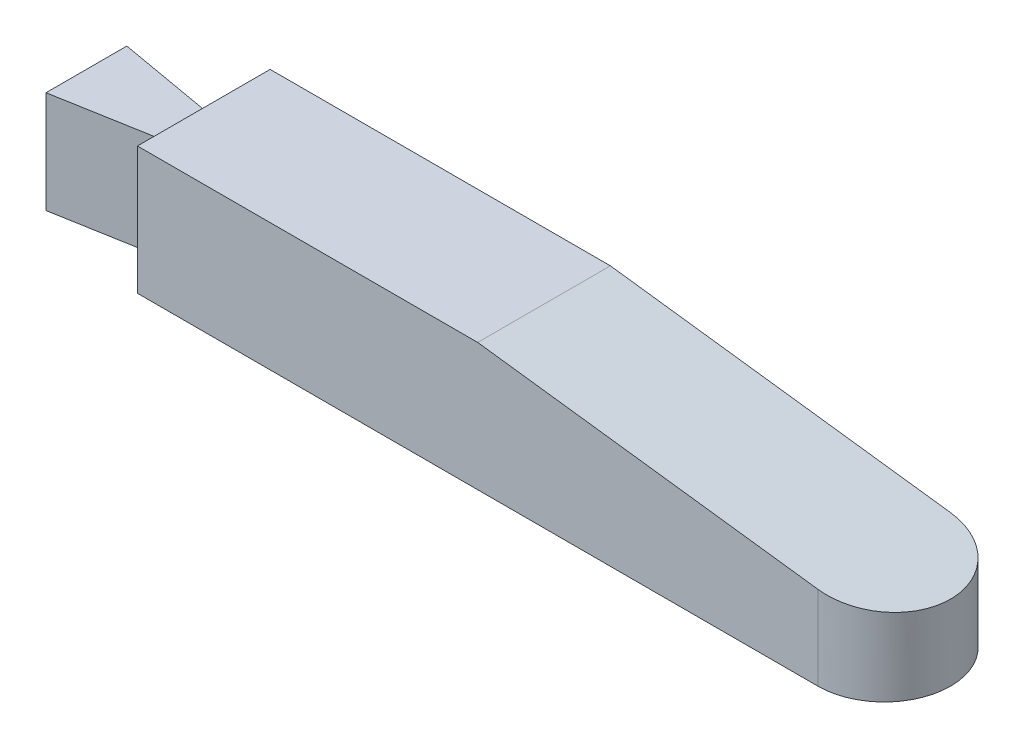
ISO-10303-21;
HEADER;
FILE_DESCRIPTION(('STEP AP214'),'2;1');
FILE_NAME('part.step','',(''),(''),'','','');
FILE_SCHEMA(('AUTOMOTIVE_DESIGN { 1 0 10303 214 1 1 1 1 }'));
ENDSEC;
DATA;
#1=APPLICATION_CONTEXT('core data for automotive mechanical design processes');
#2=APPLICATION_PROTOCOL_DEFINITION('international standard','automotive_design',2000,#1);
#3=PRODUCT_CONTEXT('',#1,'mechanical');
#4=PRODUCT('Part','Part','',(#3));
#5=PRODUCT_RELATED_PRODUCT_CATEGORY('part','',(#4));
#6=PRODUCT_DEFINITION_FORMATION('','',#4);
#7=PRODUCT_DEFINITION_CONTEXT('part definition',#1,'design');
#8=PRODUCT_DEFINITION('design','',#6,#7);
#9=PRODUCT_DEFINITION_SHAPE('','',#8);
#10=(LENGTH_UNIT() NAMED_UNIT(*) SI_UNIT(.MILLI.,.METRE.));
#11=(NAMED_UNIT(*) PLANE_ANGLE_UNIT() SI_UNIT($,.RADIAN.));
#12=(NAMED_UNIT(*) SI_UNIT($,.STERADIAN.) SOLID_ANGLE_UNIT());
#13=UNCERTAINTY_MEASURE_WITH_UNIT(LENGTH_MEASURE(1.E-05),#10,'distance_accuracy_value','');
#14=(GEOMETRIC_REPRESENTATION_CONTEXT(3) GLOBAL_UNCERTAINTY_ASSIGNED_CONTEXT((#13)) GLOBAL_UNIT_ASSIGNED_CONTEXT((#10,
#11,#12)) REPRESENTATION_CONTEXT('',''));
#15=CARTESIAN_POINT('',(0.,0.,0.));
#16=DIRECTION('',(0.,0.,1.));
#17=DIRECTION('',(1.,0.,0.));
#18=AXIS2_PLACEMENT_3D('',#15,#16,#17);
#19=CARTESIAN_POINT('',(-13.5492408882498,38.1,8.6448900000001));
#20=DIRECTION('',(-0.173648177666927,0.,0.984807753012209));
#21=DIRECTION('',(0.984807753012209,0.,0.173648177666927));
#22=AXIS2_PLACEMENT_3D('',#19,#20,#21);
#23=PLANE('',#22);
#24=DIRECTION('',(-0.984807753012209,0.,-0.173648177666927));
#25=VECTOR('',#24,1.);
#26=CARTESIAN_POINT('',(21.5027591117502,30.48,14.8255033277931));
#27=LINE('',#26,#25);
#28=CARTESIAN_POINT('',(21.5027591117502,30.48,14.8255033277931));
#29=VERTEX_POINT('',#28);
#30=CARTESIAN_POINT('',(-13.5492408882498,30.48,8.6448900000001));
#31=VERTEX_POINT('',#30);
#32=EDGE_CURVE('E198',#29,#31,#27,.T.);
#33=ORIENTED_EDGE('',*,*,#32,.F.);
#34=DIRECTION('',(0.,-1.,0.));
#35=VECTOR('',#34,1.);
#36=CARTESIAN_POINT('',(21.5027591117502,38.1,14.8255033277931));
#37=LINE('',#36,#35);
#38=CARTESIAN_POINT('',(21.5027591117502,0.,14.8255033277931));
#39=VERTEX_POINT('',#38);
#40=EDGE_CURVE('E11',#29,#39,#37,.T.);
#41=ORIENTED_EDGE('',*,*,#40,.T.);
#42=DIRECTION('',(-0.984807753012209,0.,-0.173648177666927));
#43=VECTOR('',#42,1.);
#44=CARTESIAN_POINT('',(-13.5492408882498,0.,8.6448900000001));
#45=LINE('',#44,#43);
#46=CARTESIAN_POINT('',(-13.5492408882498,0.,8.6448900000001));
#47=VERTEX_POINT('',#46);
#48=EDGE_CURVE('E124',#39,#47,#45,.T.);
#49=ORIENTED_EDGE('',*,*,#48,.T.);
#50=DIRECTION('',(0.,-1.,0.));
#51=VECTOR('',#50,1.);
#52=CARTESIAN_POINT('',(-13.5492408882498,38.1,8.6448900000001));
#53=LINE('',#52,#51);
#54=EDGE_CURVE('E53',#31,#47,#53,.T.);
#55=ORIENTED_EDGE('',*,*,#54,.F.);
#56=EDGE_LOOP('',(#33,#41,#49,#55));
#57=FACE_BOUND('',#56,.T.);
#58=ADVANCED_FACE('F45',(#57),#23,.F.);
#59=CARTESIAN_POINT('',(-13.5492408882498,38.1,8.6448900000001));
#60=DIRECTION('',(1.,0.,0.));
#61=DIRECTION('',(0.,0.,-1.));
#62=AXIS2_PLACEMENT_3D('',#59,#60,#61);
#63=PLANE('',#62);
#64=DIRECTION('',(0.,0.,1.));
#65=VECTOR('',#64,1.);
#66=CARTESIAN_POINT('',(-13.5492408882498,30.48,8.6448900000001));
#67=LINE('',#66,#65);
#68=CARTESIAN_POINT('',(-13.5492408882498,30.48,32.7748900000001));
#69=VERTEX_POINT('',#68);
#70=EDGE_CURVE('E177',#31,#69,#67,.T.);
#71=ORIENTED_EDGE('',*,*,#70,.F.);
#72=ORIENTED_EDGE('',*,*,#54,.T.);
#73=DIRECTION('',(0.,0.,1.));
#74=VECTOR('',#73,1.);
#75=CARTESIAN_POINT('',(-13.5492408882498,0.,8.6448900000001));
#76=LINE('',#75,#74);
#77=CARTESIAN_POINT('',(-13.5492408882498,0.,32.7748900000001));
#78=VERTEX_POINT('',#77);
#79=EDGE_CURVE('E130',#47,#78,#76,.T.);
#80=ORIENTED_EDGE('',*,*,#79,.T.);
#81=DIRECTION('',(0.,-1.,0.));
#82=VECTOR('',#81,1.);
#83=CARTESIAN_POINT('',(-13.5492408882498,38.1,32.7748900000001));
#84=LINE('',#83,#82);
#85=EDGE_CURVE('E166',#69,#78,#84,.T.);
#86=ORIENTED_EDGE('',*,*,#85,.F.);
#87=EDGE_LOOP('',(#71,#72,#80,#86));
#88=FACE_BOUND('',#87,.T.);
#89=ADVANCED_FACE('F172',(#88),#63,.F.);
#90=CARTESIAN_POINT('',(-13.5492408882498,38.1,32.7748900000001));
#91=DIRECTION('',(-0.173648177666935,0.,-0.984807753012207));
#92=DIRECTION('',(-0.984807753012207,0.,0.173648177666935));
#93=AXIS2_PLACEMENT_3D('',#90,#91,#92);
#94=PLANE('',#93);
#95=DIRECTION('',(0.984807753012207,0.,-0.173648177666935));
#96=VECTOR('',#95,1.);
#97=CARTESIAN_POINT('',(-13.5492408882498,30.48,32.7748900000001));
#98=LINE('',#97,#96);
#99=CARTESIAN_POINT('',(21.5027591117502,30.48,26.5942766722068));
#100=VERTEX_POINT('',#99);
#101=EDGE_CURVE('E133',#69,#100,#98,.T.);
#102=ORIENTED_EDGE('',*,*,#101,.F.);
#103=ORIENTED_EDGE('',*,*,#85,.T.);
#104=DIRECTION('',(0.984807753012207,0.,-0.173648177666935));
#105=VECTOR('',#104,1.);
#106=CARTESIAN_POINT('',(-13.5492408882498,0.,32.7748900000001));
#107=LINE('',#106,#105);
#108=CARTESIAN_POINT('',(21.5027591117502,0.,26.5942766722068));
#109=VERTEX_POINT('',#108);
#110=EDGE_CURVE('E141',#78,#109,#107,.T.);
#111=ORIENTED_EDGE('',*,*,#110,.T.);
#112=DIRECTION('',(0.,-1.,0.));
#113=VECTOR('',#112,1.);
#114=CARTESIAN_POINT('',(21.5027591117502,38.1,26.5942766722068));
#115=LINE('',#114,#113);
#116=EDGE_CURVE('E163',#100,#109,#115,.T.);
#117=ORIENTED_EDGE('',*,*,#116,.F.);
#118=EDGE_LOOP('',(#102,#103,#111,#117));
#119=FACE_BOUND('',#118,.T.);
#120=ADVANCED_FACE('F185',(#119),#94,.F.);
#121=CARTESIAN_POINT('',(21.5027591117502,38.1,40.5218900000002));
#122=DIRECTION('',(1.,0.,0.));
#123=DIRECTION('',(0.,0.,-1.));
#124=AXIS2_PLACEMENT_3D('',#121,#122,#123);
#125=PLANE('',#124);
#126=DIRECTION('',(0.,0.,1.));
#127=VECTOR('',#126,1.);
#128=CARTESIAN_POINT('',(21.5027591117502,0.,40.5218900000002));
#129=LINE('',#128,#127);
#130=CARTESIAN_POINT('',(21.5027591117502,0.,40.5218900000002));
#131=VERTEX_POINT('',#130);
#132=EDGE_CURVE('E145',#109,#131,#129,.T.);
#133=ORIENTED_EDGE('',*,*,#132,.T.);
#134=DIRECTION('',(0.,-1.,0.));
#135=VECTOR('',#134,1.);
#136=CARTESIAN_POINT('',(21.5027591117502,38.1,40.5218900000002));
#137=LINE('',#136,#135);
#138=CARTESIAN_POINT('',(21.5027591117502,38.1,40.5218900000002));
#139=VERTEX_POINT('',#138);
#140=EDGE_CURVE('E159',#139,#131,#137,.T.);
#141=ORIENTED_EDGE('',*,*,#140,.F.);
#142=DIRECTION('',(0.,0.,1.));
#143=VECTOR('',#142,1.);
#144=CARTESIAN_POINT('',(21.5027591117502,38.1,0.897890000000207));
#145=LINE('',#144,#143);
#146=CARTESIAN_POINT('',(21.5027591117502,38.1,0.897890000000207));
#147=VERTEX_POINT('',#146);
#148=EDGE_CURVE('E109',#147,#139,#145,.T.);
#149=ORIENTED_EDGE('',*,*,#148,.F.);
#150=DIRECTION('',(0.,-1.,0.));
#151=VECTOR('',#150,1.);
#152=CARTESIAN_POINT('',(21.5027591117502,38.1,0.897890000000207));
#153=LINE('',#152,#151);
#154=CARTESIAN_POINT('',(21.5027591117502,0.,0.897890000000207));
#155=VERTEX_POINT('',#154);
#156=EDGE_CURVE('E100',#147,#155,#153,.T.);
#157=ORIENTED_EDGE('',*,*,#156,.T.);
#158=DIRECTION('',(0.,0.,1.));
#159=VECTOR('',#158,1.);
#160=CARTESIAN_POINT('',(21.5027591117502,0.,0.897890000000207));
#161=LINE('',#160,#159);
#162=EDGE_CURVE('E116',#155,#39,#161,.T.);
#163=ORIENTED_EDGE('',*,*,#162,.T.);
#164=ORIENTED_EDGE('',*,*,#40,.F.);
#165=DIRECTION('',(0.,0.,-1.));
#166=VECTOR('',#165,1.);
#167=CARTESIAN_POINT('',(21.5027591117502,30.48,26.5942766722068));
#168=LINE('',#167,#166);
#169=EDGE_CURVE('E126',#100,#29,#168,.T.);
#170=ORIENTED_EDGE('',*,*,#169,.F.);
#171=ORIENTED_EDGE('',*,*,#116,.T.);
#172=EDGE_LOOP('',(#133,#141,#149,#157,#163,#164,#170,#171));
#173=FACE_BOUND('',#172,.T.);
#174=ADVANCED_FACE('F114',(#173),#125,.F.);
#175=CARTESIAN_POINT('',(21.5027591117502,38.1,40.5218900000002));
#176=DIRECTION('',(0.,0.,-1.));
#177=DIRECTION('',(-1.,0.,0.));
#178=AXIS2_PLACEMENT_3D('',#175,#176,#177);
#179=PLANE('',#178);
#180=DIRECTION('',(0.,-1.,0.));
#181=VECTOR('',#180,1.);
#182=CARTESIAN_POINT('',(224.70275911175,38.1,40.5218900000002));
#183=LINE('',#182,#181);
#184=CARTESIAN_POINT('',(224.70275911175,25.062054565206,40.5218900000002));
#185=VERTEX_POINT('',#184);
#186=CARTESIAN_POINT('',(224.70275911175,0.,40.5218900000002));
#187=VERTEX_POINT('',#186);
#188=EDGE_CURVE('E156',#185,#187,#183,.T.);
#189=ORIENTED_EDGE('',*,*,#188,.F.);
#190=DIRECTION('',(0.99186650650236,-0.127282493999779,0.));
#191=VECTOR('',#190,1.);
#192=CARTESIAN_POINT('',(123.10275911175,38.1,40.5218900000002));
#193=LINE('',#192,#191);
#194=CARTESIAN_POINT('',(123.10275911175,38.1,40.5218900000002));
#195=VERTEX_POINT('',#194);
#196=EDGE_CURVE('E227',#195,#185,#193,.T.);
#197=ORIENTED_EDGE('',*,*,#196,.F.);
#198=DIRECTION('',(1.,0.,0.));
#199=VECTOR('',#198,1.);
#200=CARTESIAN_POINT('',(21.5027591117502,38.1,40.5218900000002));
#201=LINE('',#200,#199);
#202=EDGE_CURVE('E213',#139,#195,#201,.T.);
#203=ORIENTED_EDGE('',*,*,#202,.F.);
#204=ORIENTED_EDGE('',*,*,#140,.T.);
#205=DIRECTION('',(1.,0.,0.));
#206=VECTOR('',#205,1.);
#207=CARTESIAN_POINT('',(21.5027591117502,0.,40.5218900000002));
#208=LINE('',#207,#206);
#209=EDGE_CURVE('E148',#131,#187,#208,.T.);
#210=ORIENTED_EDGE('',*,*,#209,.T.);
#211=EDGE_LOOP('',(#189,#197,#203,#204,#210));
#212=FACE_BOUND('',#211,.T.);
#213=ADVANCED_FACE('F225',(#212),#179,.F.);
#214=CARTESIAN_POINT('',(224.70275911175,38.1,20.7098900000002));
#215=DIRECTION('',(0.,-1.,0.));
#216=DIRECTION('',(0.,0.,-1.));
#217=AXIS2_PLACEMENT_3D('',#214,#215,#216);
#218=CYLINDRICAL_SURFACE('',#217,19.812);
#219=CARTESIAN_POINT('',(224.70275911175,25.062054565206,20.7098900000002));
#220=DIRECTION('',(-0.127282493999779,-0.99186650650236,0.));
#221=DIRECTION('',(0.99186650650236,-0.127282493999779,0.));
#222=AXIS2_PLACEMENT_3D('',#219,#220,#221);
#223=ELLIPSE('',#222,19.9744621580816,19.812);
#224=CARTESIAN_POINT('',(224.70275911175,25.062054565206,0.8978900000002));
#225=VERTEX_POINT('',#224);
#226=EDGE_CURVE('E200',#225,#185,#223,.T.);
#227=ORIENTED_EDGE('',*,*,#226,.T.);
#228=ORIENTED_EDGE('',*,*,#188,.T.);
#229=CARTESIAN_POINT('',(224.70275911175,0.,20.7098900000002));
#230=DIRECTION('',(0.,1.,0.));
#231=DIRECTION('',(0.,0.,-1.));
#232=AXIS2_PLACEMENT_3D('',#229,#230,#231);
#233=CIRCLE('',#232,19.812);
#234=CARTESIAN_POINT('',(224.70275911175,0.,0.8978900000002));
#235=VERTEX_POINT('',#234);
#236=EDGE_CURVE('E110',#187,#235,#233,.T.);
#237=ORIENTED_EDGE('',*,*,#236,.T.);
#238=DIRECTION('',(0.,-1.,0.));
#239=VECTOR('',#238,1.);
#240=CARTESIAN_POINT('',(224.70275911175,38.1,0.8978900000002));
#241=LINE('',#240,#239);
#242=EDGE_CURVE('E103',#225,#235,#241,.T.);
#243=ORIENTED_EDGE('',*,*,#242,.F.);
#244=EDGE_LOOP('',(#227,#228,#237,#243));
#245=FACE_BOUND('',#244,.T.);
#246=ADVANCED_FACE('F255',(#245),#218,.T.);
#247=CARTESIAN_POINT('',(21.5027591117502,38.1,0.897890000000207));
#248=DIRECTION('',(0.,0.,1.));
#249=DIRECTION('',(1.,0.,0.));
#250=AXIS2_PLACEMENT_3D('',#247,#248,#249);
#251=PLANE('',#250);
#252=DIRECTION('',(-1.,0.,0.));
#253=VECTOR('',#252,1.);
#254=CARTESIAN_POINT('',(21.5027591117502,38.1,0.897890000000207));
#255=LINE('',#254,#253);
#256=CARTESIAN_POINT('',(123.10275911175,38.1,0.897890000000203));
#257=VERTEX_POINT('',#256);
#258=EDGE_CURVE('E68',#257,#147,#255,.T.);
#259=ORIENTED_EDGE('',*,*,#258,.F.);
#260=DIRECTION('',(0.99186650650236,-0.127282493999779,0.));
#261=VECTOR('',#260,1.);
#262=CARTESIAN_POINT('',(123.10275911175,38.1,0.8978900000002));
#263=LINE('',#262,#261);
#264=EDGE_CURVE('E60',#257,#225,#263,.T.);
#265=ORIENTED_EDGE('',*,*,#264,.T.);
#266=ORIENTED_EDGE('',*,*,#242,.T.);
#267=DIRECTION('',(-1.,0.,0.));
#268=VECTOR('',#267,1.);
#269=CARTESIAN_POINT('',(21.5027591117502,0.,0.897890000000207));
#270=LINE('',#269,#268);
#271=EDGE_CURVE('E97',#235,#155,#270,.T.);
#272=ORIENTED_EDGE('',*,*,#271,.T.);
#273=ORIENTED_EDGE('',*,*,#156,.F.);
#274=EDGE_LOOP('',(#259,#265,#266,#272,#273));
#275=FACE_BOUND('',#274,.T.);
#276=ADVANCED_FACE('F99',(#275),#251,.F.);
#277=CARTESIAN_POINT('',(224.70275911175,38.1,20.7098900000002));
#278=DIRECTION('',(0.,-1.,0.));
#279=DIRECTION('',(0.,0.,-1.));
#280=AXIS2_PLACEMENT_3D('',#277,#278,#279);
#281=PLANE('',#280);
#282=ORIENTED_EDGE('',*,*,#202,.T.);
#283=DIRECTION('',(0.,0.,1.));
#284=VECTOR('',#283,1.);
#285=CARTESIAN_POINT('',(123.10275911175,38.1,0.8978900000002));
#286=LINE('',#285,#284);
#287=EDGE_CURVE('E206',#257,#195,#286,.T.);
#288=ORIENTED_EDGE('',*,*,#287,.F.);
#289=ORIENTED_EDGE('',*,*,#258,.T.);
#290=ORIENTED_EDGE('',*,*,#148,.T.);
#291=EDGE_LOOP('',(#282,#288,#289,#290));
#292=FACE_BOUND('',#291,.T.);
#293=ADVANCED_FACE('F219',(#292),#281,.F.);
#294=CARTESIAN_POINT('',(224.70275911175,0.,20.7098900000002));
#295=DIRECTION('',(0.,-1.,0.));
#296=DIRECTION('',(0.,0.,-1.));
#297=AXIS2_PLACEMENT_3D('',#294,#295,#296);
#298=PLANE('',#297);
#299=ORIENTED_EDGE('',*,*,#162,.F.);
#300=ORIENTED_EDGE('',*,*,#271,.F.);
#301=ORIENTED_EDGE('',*,*,#236,.F.);
#302=ORIENTED_EDGE('',*,*,#209,.F.);
#303=ORIENTED_EDGE('',*,*,#132,.F.);
#304=ORIENTED_EDGE('',*,*,#110,.F.);
#305=ORIENTED_EDGE('',*,*,#79,.F.);
#306=ORIENTED_EDGE('',*,*,#48,.F.);
#307=EDGE_LOOP('',(#299,#300,#301,#302,#303,#304,#305,#306));
#308=FACE_BOUND('',#307,.T.);
#309=ADVANCED_FACE('F121',(#308),#298,.T.);
#310=CARTESIAN_POINT('',(0.,30.48,0.));
#311=DIRECTION('',(0.,1.,0.));
#312=DIRECTION('',(0.,0.,1.));
#313=AXIS2_PLACEMENT_3D('',#310,#311,#312);
#314=PLANE('',#313);
#315=ORIENTED_EDGE('',*,*,#32,.T.);
#316=ORIENTED_EDGE('',*,*,#70,.T.);
#317=ORIENTED_EDGE('',*,*,#101,.T.);
#318=ORIENTED_EDGE('',*,*,#169,.T.);
#319=EDGE_LOOP('',(#315,#316,#317,#318));
#320=FACE_BOUND('',#319,.T.);
#321=ADVANCED_FACE('F197',(#320),#314,.T.);
#322=CARTESIAN_POINT('',(123.10275911175,38.1,0.8978900000002));
#323=DIRECTION('',(-0.127282493999779,-0.99186650650236,0.));
#324=DIRECTION('',(0.99186650650236,-0.127282493999779,0.));
#325=AXIS2_PLACEMENT_3D('',#322,#323,#324);
#326=PLANE('',#325);
#327=ORIENTED_EDGE('',*,*,#226,.F.);
#328=ORIENTED_EDGE('',*,*,#264,.F.);
#329=ORIENTED_EDGE('',*,*,#287,.T.);
#330=ORIENTED_EDGE('',*,*,#196,.T.);
#331=EDGE_LOOP('',(#327,#328,#329,#330));
#332=FACE_BOUND('',#331,.T.);
#333=ADVANCED_FACE('F233',(#332),#326,.F.);
#334=CLOSED_SHELL('',(#58,#89,#120,#174,#213,#246,#276,#293,#309,#321,#333));
#335=MANIFOLD_SOLID_BREP('B2',#334);
#336=ADVANCED_BREP_SHAPE_REPRESENTATION('',(#18,#335),#14);
#337=SHAPE_DEFINITION_REPRESENTATION(#9,#336);
ENDSEC;
END-ISO-10303-21;
